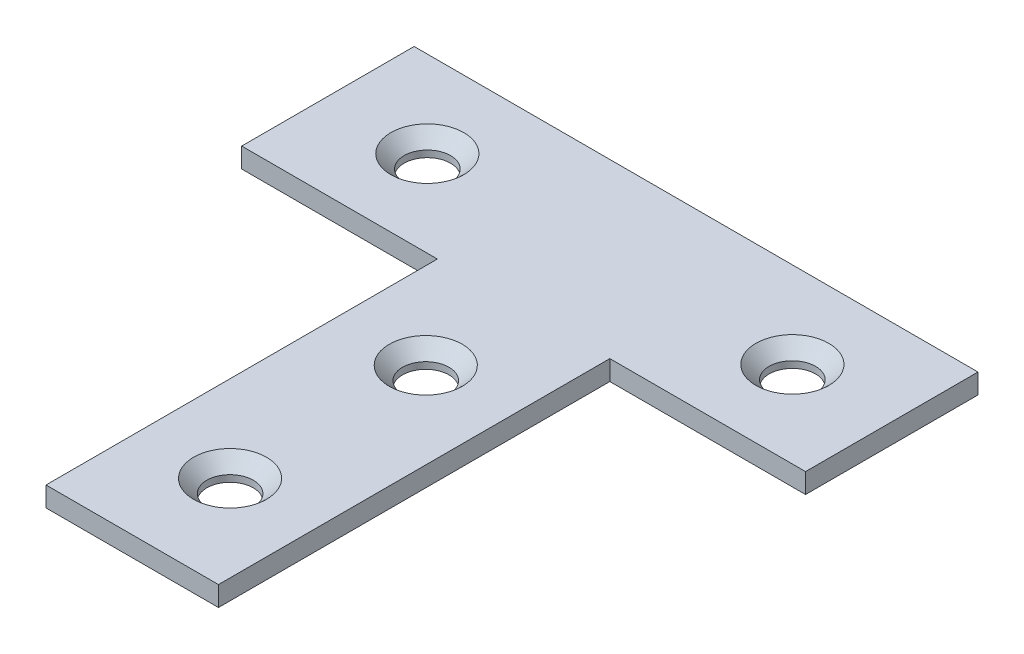
ISO-10303-21;
HEADER;
FILE_DESCRIPTION(('STEP AP214'),'2;1');
FILE_NAME('part.step','',(''),(''),'','','');
FILE_SCHEMA(('AUTOMOTIVE_DESIGN { 1 0 10303 214 1 1 1 1 }'));
ENDSEC;
DATA;
#1=APPLICATION_CONTEXT('core data for automotive mechanical design processes');
#2=APPLICATION_PROTOCOL_DEFINITION('international standard','automotive_design',2000,#1);
#3=PRODUCT_CONTEXT('',#1,'mechanical');
#4=PRODUCT('Part','Part','',(#3));
#5=PRODUCT_RELATED_PRODUCT_CATEGORY('part','',(#4));
#6=PRODUCT_DEFINITION_FORMATION('','',#4);
#7=PRODUCT_DEFINITION_CONTEXT('part definition',#1,'design');
#8=PRODUCT_DEFINITION('design','',#6,#7);
#9=PRODUCT_DEFINITION_SHAPE('','',#8);
#10=(LENGTH_UNIT() NAMED_UNIT(*) SI_UNIT(.MILLI.,.METRE.));
#11=(NAMED_UNIT(*) PLANE_ANGLE_UNIT() SI_UNIT($,.RADIAN.));
#12=(NAMED_UNIT(*) SI_UNIT($,.STERADIAN.) SOLID_ANGLE_UNIT());
#13=UNCERTAINTY_MEASURE_WITH_UNIT(LENGTH_MEASURE(1.E-05),#10,'distance_accuracy_value','');
#14=(GEOMETRIC_REPRESENTATION_CONTEXT(3) GLOBAL_UNCERTAINTY_ASSIGNED_CONTEXT((#13)) GLOBAL_UNIT_ASSIGNED_CONTEXT((#10,
#11,#12)) REPRESENTATION_CONTEXT('',''));
#15=CARTESIAN_POINT('',(0.,0.,0.));
#16=DIRECTION('',(0.,0.,1.));
#17=DIRECTION('',(1.,0.,0.));
#18=AXIS2_PLACEMENT_3D('',#15,#16,#17);
#19=CARTESIAN_POINT('',(21.25,1.5,-17.8484712230216));
#20=DIRECTION('',(1.,0.,0.));
#21=DIRECTION('',(0.,0.,-1.));
#22=AXIS2_PLACEMENT_3D('',#19,#20,#21);
#23=PLANE('',#22);
#24=DIRECTION('',(0.,0.,1.));
#25=VECTOR('',#24,1.);
#26=CARTESIAN_POINT('',(21.25,0.,-17.8484712230216));
#27=LINE('',#26,#25);
#28=CARTESIAN_POINT('',(21.25,0.,-17.8484712230216));
#29=VERTEX_POINT('',#28);
#30=CARTESIAN_POINT('',(21.25,0.,-4.84847122302159));
#31=VERTEX_POINT('',#30);
#32=EDGE_CURVE('E148',#29,#31,#27,.T.);
#33=ORIENTED_EDGE('',*,*,#32,.F.);
#34=DIRECTION('',(0.,-1.,0.));
#35=VECTOR('',#34,1.);
#36=CARTESIAN_POINT('',(21.25,1.5,-17.8484712230216));
#37=LINE('',#36,#35);
#38=CARTESIAN_POINT('',(21.25,1.5,-17.8484712230216));
#39=VERTEX_POINT('',#38);
#40=EDGE_CURVE('E59',#39,#29,#37,.T.);
#41=ORIENTED_EDGE('',*,*,#40,.F.);
#42=DIRECTION('',(0.,0.,1.));
#43=VECTOR('',#42,1.);
#44=CARTESIAN_POINT('',(21.25,1.5,-17.8484712230216));
#45=LINE('',#44,#43);
#46=CARTESIAN_POINT('',(21.25,1.5,-4.84847122302159));
#47=VERTEX_POINT('',#46);
#48=EDGE_CURVE('E175',#39,#47,#45,.T.);
#49=ORIENTED_EDGE('',*,*,#48,.T.);
#50=DIRECTION('',(0.,-1.,0.));
#51=VECTOR('',#50,1.);
#52=CARTESIAN_POINT('',(21.25,1.5,-4.84847122302159));
#53=LINE('',#52,#51);
#54=EDGE_CURVE('E97',#47,#31,#53,.T.);
#55=ORIENTED_EDGE('',*,*,#54,.T.);
#56=EDGE_LOOP('',(#33,#41,#49,#55));
#57=FACE_BOUND('',#56,.T.);
#58=ADVANCED_FACE('F40',(#57),#23,.T.);
#59=CARTESIAN_POINT('',(21.25,1.5,-17.8484712230216));
#60=DIRECTION('',(0.,0.,1.));
#61=DIRECTION('',(1.,0.,0.));
#62=AXIS2_PLACEMENT_3D('',#59,#60,#61);
#63=PLANE('',#62);
#64=DIRECTION('',(-1.,0.,0.));
#65=VECTOR('',#64,1.);
#66=CARTESIAN_POINT('',(21.25,0.,-17.8484712230216));
#67=LINE('',#66,#65);
#68=CARTESIAN_POINT('',(-21.25,0.,-17.8484712230216));
#69=VERTEX_POINT('',#68);
#70=EDGE_CURVE('E88',#29,#69,#67,.T.);
#71=ORIENTED_EDGE('',*,*,#70,.T.);
#72=DIRECTION('',(0.,-1.,0.));
#73=VECTOR('',#72,1.);
#74=CARTESIAN_POINT('',(-21.25,1.5,-17.8484712230216));
#75=LINE('',#74,#73);
#76=CARTESIAN_POINT('',(-21.25,1.5,-17.8484712230216));
#77=VERTEX_POINT('',#76);
#78=EDGE_CURVE('E132',#77,#69,#75,.T.);
#79=ORIENTED_EDGE('',*,*,#78,.F.);
#80=DIRECTION('',(-1.,0.,0.));
#81=VECTOR('',#80,1.);
#82=CARTESIAN_POINT('',(21.25,1.5,-17.8484712230216));
#83=LINE('',#82,#81);
#84=EDGE_CURVE('E120',#39,#77,#83,.T.);
#85=ORIENTED_EDGE('',*,*,#84,.F.);
#86=ORIENTED_EDGE('',*,*,#40,.T.);
#87=EDGE_LOOP('',(#71,#79,#85,#86));
#88=FACE_BOUND('',#87,.T.);
#89=ADVANCED_FACE('F258',(#88),#63,.F.);
#90=CARTESIAN_POINT('',(-21.25,1.5,-17.8484712230216));
#91=DIRECTION('',(1.,0.,0.));
#92=DIRECTION('',(0.,0.,-1.));
#93=AXIS2_PLACEMENT_3D('',#90,#91,#92);
#94=PLANE('',#93);
#95=DIRECTION('',(0.,0.,1.));
#96=VECTOR('',#95,1.);
#97=CARTESIAN_POINT('',(-21.25,0.,-17.8484712230216));
#98=LINE('',#97,#96);
#99=CARTESIAN_POINT('',(-21.25,0.,-4.84847122302159));
#100=VERTEX_POINT('',#99);
#101=EDGE_CURVE('E128',#69,#100,#98,.T.);
#102=ORIENTED_EDGE('',*,*,#101,.T.);
#103=DIRECTION('',(0.,-1.,0.));
#104=VECTOR('',#103,1.);
#105=CARTESIAN_POINT('',(-21.25,1.5,-4.84847122302159));
#106=LINE('',#105,#104);
#107=CARTESIAN_POINT('',(-21.25,1.5,-4.84847122302159));
#108=VERTEX_POINT('',#107);
#109=EDGE_CURVE('E125',#108,#100,#106,.T.);
#110=ORIENTED_EDGE('',*,*,#109,.F.);
#111=DIRECTION('',(0.,0.,1.));
#112=VECTOR('',#111,1.);
#113=CARTESIAN_POINT('',(-21.25,1.5,-17.8484712230216));
#114=LINE('',#113,#112);
#115=EDGE_CURVE('E113',#77,#108,#114,.T.);
#116=ORIENTED_EDGE('',*,*,#115,.F.);
#117=ORIENTED_EDGE('',*,*,#78,.T.);
#118=EDGE_LOOP('',(#102,#110,#116,#117));
#119=FACE_BOUND('',#118,.T.);
#120=ADVANCED_FACE('F126',(#119),#94,.F.);
#121=CARTESIAN_POINT('',(-21.25,1.5,-4.84847122302159));
#122=DIRECTION('',(0.,0.,-1.));
#123=DIRECTION('',(-1.,0.,0.));
#124=AXIS2_PLACEMENT_3D('',#121,#122,#123);
#125=PLANE('',#124);
#126=DIRECTION('',(1.,0.,0.));
#127=VECTOR('',#126,1.);
#128=CARTESIAN_POINT('',(-21.25,0.,-4.84847122302159));
#129=LINE('',#128,#127);
#130=CARTESIAN_POINT('',(-6.5,0.,-4.84847122302159));
#131=VERTEX_POINT('',#130);
#132=EDGE_CURVE('E168',#100,#131,#129,.T.);
#133=ORIENTED_EDGE('',*,*,#132,.T.);
#134=DIRECTION('',(0.,-1.,0.));
#135=VECTOR('',#134,1.);
#136=CARTESIAN_POINT('',(-6.5,1.5,-4.84847122302159));
#137=LINE('',#136,#135);
#138=CARTESIAN_POINT('',(-6.5,1.5,-4.84847122302159));
#139=VERTEX_POINT('',#138);
#140=EDGE_CURVE('E133',#139,#131,#137,.T.);
#141=ORIENTED_EDGE('',*,*,#140,.F.);
#142=DIRECTION('',(1.,0.,0.));
#143=VECTOR('',#142,1.);
#144=CARTESIAN_POINT('',(-21.25,1.5,-4.84847122302159));
#145=LINE('',#144,#143);
#146=EDGE_CURVE('E118',#108,#139,#145,.T.);
#147=ORIENTED_EDGE('',*,*,#146,.F.);
#148=ORIENTED_EDGE('',*,*,#109,.T.);
#149=EDGE_LOOP('',(#133,#141,#147,#148));
#150=FACE_BOUND('',#149,.T.);
#151=ADVANCED_FACE('F135',(#150),#125,.F.);
#152=CARTESIAN_POINT('',(-6.5,1.5,-4.84847122302159));
#153=DIRECTION('',(1.,0.,0.));
#154=DIRECTION('',(0.,0.,-1.));
#155=AXIS2_PLACEMENT_3D('',#152,#153,#154);
#156=PLANE('',#155);
#157=DIRECTION('',(0.,0.,1.));
#158=VECTOR('',#157,1.);
#159=CARTESIAN_POINT('',(-6.5,0.,-4.84847122302159));
#160=LINE('',#159,#158);
#161=CARTESIAN_POINT('',(-6.49999999999999,0.,24.6515287769784));
#162=VERTEX_POINT('',#161);
#163=EDGE_CURVE('E165',#131,#162,#160,.T.);
#164=ORIENTED_EDGE('',*,*,#163,.T.);
#165=DIRECTION('',(0.,-1.,0.));
#166=VECTOR('',#165,1.);
#167=CARTESIAN_POINT('',(-6.49999999999999,1.5,24.6515287769784));
#168=LINE('',#167,#166);
#169=CARTESIAN_POINT('',(-6.49999999999999,1.5,24.6515287769784));
#170=VERTEX_POINT('',#169);
#171=EDGE_CURVE('E183',#170,#162,#168,.T.);
#172=ORIENTED_EDGE('',*,*,#171,.F.);
#173=DIRECTION('',(0.,0.,1.));
#174=VECTOR('',#173,1.);
#175=CARTESIAN_POINT('',(-6.5,1.5,-4.84847122302159));
#176=LINE('',#175,#174);
#177=EDGE_CURVE('E139',#139,#170,#176,.T.);
#178=ORIENTED_EDGE('',*,*,#177,.F.);
#179=ORIENTED_EDGE('',*,*,#140,.T.);
#180=EDGE_LOOP('',(#164,#172,#178,#179));
#181=FACE_BOUND('',#180,.T.);
#182=ADVANCED_FACE('F273',(#181),#156,.F.);
#183=CARTESIAN_POINT('',(-6.49999999999999,1.5,24.6515287769784));
#184=DIRECTION('',(0.,0.,-1.));
#185=DIRECTION('',(-1.,0.,0.));
#186=AXIS2_PLACEMENT_3D('',#183,#184,#185);
#187=PLANE('',#186);
#188=DIRECTION('',(1.,0.,0.));
#189=VECTOR('',#188,1.);
#190=CARTESIAN_POINT('',(-6.49999999999999,0.,24.6515287769784));
#191=LINE('',#190,#189);
#192=CARTESIAN_POINT('',(6.50000000000001,0.,24.6515287769784));
#193=VERTEX_POINT('',#192);
#194=EDGE_CURVE('E161',#162,#193,#191,.T.);
#195=ORIENTED_EDGE('',*,*,#194,.T.);
#196=DIRECTION('',(0.,-1.,0.));
#197=VECTOR('',#196,1.);
#198=CARTESIAN_POINT('',(6.50000000000001,1.5,24.6515287769784));
#199=LINE('',#198,#197);
#200=CARTESIAN_POINT('',(6.50000000000001,1.5,24.6515287769784));
#201=VERTEX_POINT('',#200);
#202=EDGE_CURVE('E187',#201,#193,#199,.T.);
#203=ORIENTED_EDGE('',*,*,#202,.F.);
#204=DIRECTION('',(1.,0.,0.));
#205=VECTOR('',#204,1.);
#206=CARTESIAN_POINT('',(-6.49999999999999,1.5,24.6515287769784));
#207=LINE('',#206,#205);
#208=EDGE_CURVE('E142',#170,#201,#207,.T.);
#209=ORIENTED_EDGE('',*,*,#208,.F.);
#210=ORIENTED_EDGE('',*,*,#171,.T.);
#211=EDGE_LOOP('',(#195,#203,#209,#210));
#212=FACE_BOUND('',#211,.T.);
#213=ADVANCED_FACE('F269',(#212),#187,.F.);
#214=CARTESIAN_POINT('',(6.5,1.5,-4.84847122302159));
#215=DIRECTION('',(1.,0.,0.));
#216=DIRECTION('',(0.,0.,-1.));
#217=AXIS2_PLACEMENT_3D('',#214,#215,#216);
#218=PLANE('',#217);
#219=DIRECTION('',(0.,0.,1.));
#220=VECTOR('',#219,1.);
#221=CARTESIAN_POINT('',(6.5,0.,-4.84847122302159));
#222=LINE('',#221,#220);
#223=CARTESIAN_POINT('',(6.5,0.,-4.84847122302159));
#224=VERTEX_POINT('',#223);
#225=EDGE_CURVE('E157',#224,#193,#222,.T.);
#226=ORIENTED_EDGE('',*,*,#225,.F.);
#227=DIRECTION('',(0.,-1.,0.));
#228=VECTOR('',#227,1.);
#229=CARTESIAN_POINT('',(6.5,1.5,-4.84847122302159));
#230=LINE('',#229,#228);
#231=CARTESIAN_POINT('',(6.5,1.5,-4.84847122302159));
#232=VERTEX_POINT('',#231);
#233=EDGE_CURVE('E190',#232,#224,#230,.T.);
#234=ORIENTED_EDGE('',*,*,#233,.F.);
#235=DIRECTION('',(0.,0.,1.));
#236=VECTOR('',#235,1.);
#237=CARTESIAN_POINT('',(6.5,1.5,-4.84847122302159));
#238=LINE('',#237,#236);
#239=EDGE_CURVE('E320',#232,#201,#238,.T.);
#240=ORIENTED_EDGE('',*,*,#239,.T.);
#241=ORIENTED_EDGE('',*,*,#202,.T.);
#242=EDGE_LOOP('',(#226,#234,#240,#241));
#243=FACE_BOUND('',#242,.T.);
#244=ADVANCED_FACE('F266',(#243),#218,.T.);
#245=CARTESIAN_POINT('',(21.25,1.5,-4.84847122302159));
#246=DIRECTION('',(0.,0.,1.));
#247=DIRECTION('',(1.,0.,0.));
#248=AXIS2_PLACEMENT_3D('',#245,#246,#247);
#249=PLANE('',#248);
#250=DIRECTION('',(-1.,0.,0.));
#251=VECTOR('',#250,1.);
#252=CARTESIAN_POINT('',(21.25,0.,-4.84847122302159));
#253=LINE('',#252,#251);
#254=EDGE_CURVE('E152',#31,#224,#253,.T.);
#255=ORIENTED_EDGE('',*,*,#254,.F.);
#256=ORIENTED_EDGE('',*,*,#54,.F.);
#257=DIRECTION('',(-1.,0.,0.));
#258=VECTOR('',#257,1.);
#259=CARTESIAN_POINT('',(21.25,1.5,-4.84847122302159));
#260=LINE('',#259,#258);
#261=EDGE_CURVE('E317',#47,#232,#260,.T.);
#262=ORIENTED_EDGE('',*,*,#261,.T.);
#263=ORIENTED_EDGE('',*,*,#233,.T.);
#264=EDGE_LOOP('',(#255,#256,#262,#263));
#265=FACE_BOUND('',#264,.T.);
#266=ADVANCED_FACE('F233',(#265),#249,.T.);
#267=CARTESIAN_POINT('',(0.,1.5,0.));
#268=DIRECTION('',(0.,-1.,0.));
#269=DIRECTION('',(0.,0.,-1.));
#270=AXIS2_PLACEMENT_3D('',#267,#268,#269);
#271=PLANE('',#270);
#272=CARTESIAN_POINT('',(0.,1.5,17.2765287769784));
#273=DIRECTION('',(0.,-1.,0.));
#274=DIRECTION('',(0.,0.,-1.));
#275=AXIS2_PLACEMENT_3D('',#272,#273,#274);
#276=CIRCLE('',#275,2.75);
#277=CARTESIAN_POINT('',(0.,1.5,14.5265287769784));
#278=VERTEX_POINT('',#277);
#279=EDGE_CURVE('E210',#278,#278,#276,.T.);
#280=ORIENTED_EDGE('',*,*,#279,.T.);
#281=EDGE_LOOP('',(#280));
#282=FACE_BOUND('',#281,.T.);
#283=CARTESIAN_POINT('',(0.,1.5,2.52652877697841));
#284=DIRECTION('',(0.,-1.,0.));
#285=DIRECTION('',(0.,0.,-1.));
#286=AXIS2_PLACEMENT_3D('',#283,#284,#285);
#287=CIRCLE('',#286,2.75);
#288=CARTESIAN_POINT('',(0.,1.5,-0.223471223021595));
#289=VERTEX_POINT('',#288);
#290=EDGE_CURVE('E206',#289,#289,#287,.T.);
#291=ORIENTED_EDGE('',*,*,#290,.T.);
#292=EDGE_LOOP('',(#291));
#293=FACE_BOUND('',#292,.T.);
#294=CARTESIAN_POINT('',(13.7567998007634,1.5,-11.3484712230216));
#295=DIRECTION('',(0.,-1.,0.));
#296=DIRECTION('',(0.,0.,-1.));
#297=AXIS2_PLACEMENT_3D('',#294,#295,#296);
#298=CIRCLE('',#297,2.75);
#299=CARTESIAN_POINT('',(13.7567998007634,1.5,-14.0984712230216));
#300=VERTEX_POINT('',#299);
#301=EDGE_CURVE('E202',#300,#300,#298,.T.);
#302=ORIENTED_EDGE('',*,*,#301,.T.);
#303=EDGE_LOOP('',(#302));
#304=FACE_BOUND('',#303,.T.);
#305=CARTESIAN_POINT('',(-13.7567998007634,1.5,-11.3484712230216));
#306=DIRECTION('',(0.,-1.,0.));
#307=DIRECTION('',(0.,0.,-1.));
#308=AXIS2_PLACEMENT_3D('',#305,#306,#307);
#309=CIRCLE('',#308,2.75);
#310=CARTESIAN_POINT('',(-13.7567998007634,1.5,-14.0984712230216));
#311=VERTEX_POINT('',#310);
#312=EDGE_CURVE('E178',#311,#311,#309,.T.);
#313=ORIENTED_EDGE('',*,*,#312,.T.);
#314=EDGE_LOOP('',(#313));
#315=FACE_BOUND('',#314,.T.);
#316=ORIENTED_EDGE('',*,*,#48,.F.);
#317=ORIENTED_EDGE('',*,*,#84,.T.);
#318=ORIENTED_EDGE('',*,*,#115,.T.);
#319=ORIENTED_EDGE('',*,*,#146,.T.);
#320=ORIENTED_EDGE('',*,*,#177,.T.);
#321=ORIENTED_EDGE('',*,*,#208,.T.);
#322=ORIENTED_EDGE('',*,*,#239,.F.);
#323=ORIENTED_EDGE('',*,*,#261,.F.);
#324=EDGE_LOOP('',(#316,#317,#318,#319,#320,#321,#322,#323));
#325=FACE_BOUND('',#324,.T.);
#326=ADVANCED_FACE('F116',(#282,#293,#304,#315,#325),#271,.F.);
#327=CARTESIAN_POINT('',(0.,0.,0.));
#328=DIRECTION('',(0.,-1.,0.));
#329=DIRECTION('',(0.,0.,-1.));
#330=AXIS2_PLACEMENT_3D('',#327,#328,#329);
#331=PLANE('',#330);
#332=CARTESIAN_POINT('',(13.7567998007634,0.,-11.3484712230216));
#333=DIRECTION('',(0.,1.,0.));
#334=DIRECTION('',(0.,0.,-1.));
#335=AXIS2_PLACEMENT_3D('',#332,#333,#334);
#336=CIRCLE('',#335,1.75);
#337=CARTESIAN_POINT('',(13.7567998007634,0.,-13.0984712230216));
#338=VERTEX_POINT('',#337);
#339=EDGE_CURVE('E309',#338,#338,#336,.T.);
#340=ORIENTED_EDGE('',*,*,#339,.T.);
#341=EDGE_LOOP('',(#340));
#342=FACE_BOUND('',#341,.T.);
#343=CARTESIAN_POINT('',(-13.7567998007634,0.,-11.3484712230216));
#344=DIRECTION('',(0.,1.,0.));
#345=DIRECTION('',(0.,0.,1.));
#346=AXIS2_PLACEMENT_3D('',#343,#344,#345);
#347=CIRCLE('',#346,1.75);
#348=CARTESIAN_POINT('',(-13.7567998007634,0.,-9.59847122302159));
#349=VERTEX_POINT('',#348);
#350=EDGE_CURVE('E302',#349,#349,#347,.T.);
#351=ORIENTED_EDGE('',*,*,#350,.T.);
#352=EDGE_LOOP('',(#351));
#353=FACE_BOUND('',#352,.T.);
#354=CARTESIAN_POINT('',(0.,0.,17.2765287769784));
#355=DIRECTION('',(0.,1.,0.));
#356=DIRECTION('',(0.,0.,-1.));
#357=AXIS2_PLACEMENT_3D('',#354,#355,#356);
#358=CIRCLE('',#357,1.75);
#359=CARTESIAN_POINT('',(0.,0.,15.5265287769784));
#360=VERTEX_POINT('',#359);
#361=EDGE_CURVE('E299',#360,#360,#358,.T.);
#362=ORIENTED_EDGE('',*,*,#361,.T.);
#363=EDGE_LOOP('',(#362));
#364=FACE_BOUND('',#363,.T.);
#365=CARTESIAN_POINT('',(0.,0.,2.52652877697841));
#366=DIRECTION('',(0.,1.,0.));
#367=DIRECTION('',(0.,0.,1.));
#368=AXIS2_PLACEMENT_3D('',#365,#366,#367);
#369=CIRCLE('',#368,1.75);
#370=CARTESIAN_POINT('',(0.,0.,4.27652877697841));
#371=VERTEX_POINT('',#370);
#372=EDGE_CURVE('E153',#371,#371,#369,.T.);
#373=ORIENTED_EDGE('',*,*,#372,.T.);
#374=EDGE_LOOP('',(#373));
#375=FACE_BOUND('',#374,.T.);
#376=ORIENTED_EDGE('',*,*,#32,.T.);
#377=ORIENTED_EDGE('',*,*,#254,.T.);
#378=ORIENTED_EDGE('',*,*,#225,.T.);
#379=ORIENTED_EDGE('',*,*,#194,.F.);
#380=ORIENTED_EDGE('',*,*,#163,.F.);
#381=ORIENTED_EDGE('',*,*,#132,.F.);
#382=ORIENTED_EDGE('',*,*,#101,.F.);
#383=ORIENTED_EDGE('',*,*,#70,.F.);
#384=EDGE_LOOP('',(#376,#377,#378,#379,#380,#381,#382,#383));
#385=FACE_BOUND('',#384,.T.);
#386=ADVANCED_FACE('F232',(#342,#353,#364,#375,#385),#331,.T.);
#387=CARTESIAN_POINT('',(0.,0.,2.52652877697841));
#388=DIRECTION('',(0.,1.,0.));
#389=DIRECTION('',(0.,0.,1.));
#390=AXIS2_PLACEMENT_3D('',#387,#388,#389);
#391=CYLINDRICAL_SURFACE('',#390,1.75);
#392=CARTESIAN_POINT('',(0.,0.49999999999999,2.52652877697841));
#393=DIRECTION('',(0.,-1.,0.));
#394=DIRECTION('',(0.,0.,-1.));
#395=AXIS2_PLACEMENT_3D('',#392,#393,#394);
#396=CIRCLE('',#395,1.75);
#397=CARTESIAN_POINT('',(0.,0.49999999999999,0.776528776978408));
#398=VERTEX_POINT('',#397);
#399=EDGE_CURVE('E51',#398,#398,#396,.F.);
#400=ORIENTED_EDGE('',*,*,#399,.T.);
#401=EDGE_LOOP('',(#400));
#402=FACE_BOUND('',#401,.T.);
#403=ORIENTED_EDGE('',*,*,#372,.F.);
#404=EDGE_LOOP('',(#403));
#405=FACE_BOUND('',#404,.T.);
#406=ADVANCED_FACE('F221',(#402,#405),#391,.F.);
#407=CARTESIAN_POINT('',(0.,0.,17.2765287769784));
#408=DIRECTION('',(0.,1.,0.));
#409=DIRECTION('',(0.,0.,1.));
#410=AXIS2_PLACEMENT_3D('',#407,#408,#409);
#411=CYLINDRICAL_SURFACE('',#410,1.75);
#412=CARTESIAN_POINT('',(0.,0.500000000000001,17.2765287769784));
#413=DIRECTION('',(0.,-1.,0.));
#414=DIRECTION('',(0.,0.,-1.));
#415=AXIS2_PLACEMENT_3D('',#412,#413,#414);
#416=CIRCLE('',#415,1.75);
#417=CARTESIAN_POINT('',(0.,0.500000000000001,15.5265287769784));
#418=VERTEX_POINT('',#417);
#419=EDGE_CURVE('E214',#418,#418,#416,.F.);
#420=ORIENTED_EDGE('',*,*,#419,.T.);
#421=EDGE_LOOP('',(#420));
#422=FACE_BOUND('',#421,.T.);
#423=ORIENTED_EDGE('',*,*,#361,.F.);
#424=EDGE_LOOP('',(#423));
#425=FACE_BOUND('',#424,.T.);
#426=ADVANCED_FACE('F286',(#422,#425),#411,.F.);
#427=CARTESIAN_POINT('',(-13.7567998007634,0.,-11.3484712230216));
#428=DIRECTION('',(0.,1.,0.));
#429=DIRECTION('',(0.,0.,1.));
#430=AXIS2_PLACEMENT_3D('',#427,#428,#429);
#431=CYLINDRICAL_SURFACE('',#430,1.75);
#432=CARTESIAN_POINT('',(-13.7567998007634,0.49999999999999,-11.3484712230216));
#433=DIRECTION('',(0.,-1.,0.));
#434=DIRECTION('',(0.,0.,-1.));
#435=AXIS2_PLACEMENT_3D('',#432,#433,#434);
#436=CIRCLE('',#435,1.75);
#437=CARTESIAN_POINT('',(-13.7567998007634,0.49999999999999,-13.0984712230216));
#438=VERTEX_POINT('',#437);
#439=EDGE_CURVE('E198',#438,#438,#436,.F.);
#440=ORIENTED_EDGE('',*,*,#439,.T.);
#441=EDGE_LOOP('',(#440));
#442=FACE_BOUND('',#441,.T.);
#443=ORIENTED_EDGE('',*,*,#350,.F.);
#444=EDGE_LOOP('',(#443));
#445=FACE_BOUND('',#444,.T.);
#446=ADVANCED_FACE('F251',(#442,#445),#431,.F.);
#447=CARTESIAN_POINT('',(13.7567998007634,0.,-11.3484712230216));
#448=DIRECTION('',(0.,1.,0.));
#449=DIRECTION('',(0.,0.,1.));
#450=AXIS2_PLACEMENT_3D('',#447,#448,#449);
#451=CYLINDRICAL_SURFACE('',#450,1.75);
#452=CARTESIAN_POINT('',(13.7567998007634,0.500000000000004,-11.3484712230216));
#453=DIRECTION('',(0.,-1.,0.));
#454=DIRECTION('',(0.,0.,-1.));
#455=AXIS2_PLACEMENT_3D('',#452,#453,#454);
#456=CIRCLE('',#455,1.75);
#457=CARTESIAN_POINT('',(13.7567998007634,0.500000000000004,-13.0984712230216));
#458=VERTEX_POINT('',#457);
#459=EDGE_CURVE('E11',#458,#458,#456,.F.);
#460=ORIENTED_EDGE('',*,*,#459,.T.);
#461=EDGE_LOOP('',(#460));
#462=FACE_BOUND('',#461,.T.);
#463=ORIENTED_EDGE('',*,*,#339,.F.);
#464=EDGE_LOOP('',(#463));
#465=FACE_BOUND('',#464,.T.);
#466=ADVANCED_FACE('F242',(#462,#465),#451,.F.);
#467=CARTESIAN_POINT('',(-13.7567998007634,1.5,-11.3484712230216));
#468=DIRECTION('',(0.,1.,0.));
#469=DIRECTION('',(0.,0.,1.));
#470=AXIS2_PLACEMENT_3D('',#467,#468,#469);
#471=CONICAL_SURFACE('',#470,2.75,0.785398163397445);
#472=ORIENTED_EDGE('',*,*,#439,.F.);
#473=EDGE_LOOP('',(#472));
#474=FACE_BOUND('',#473,.T.);
#475=ORIENTED_EDGE('',*,*,#312,.F.);
#476=EDGE_LOOP('',(#475));
#477=FACE_BOUND('',#476,.T.);
#478=ADVANCED_FACE('F240',(#474,#477),#471,.F.);
#479=CARTESIAN_POINT('',(0.,1.5,17.2765287769784));
#480=DIRECTION('',(0.,1.,0.));
#481=DIRECTION('',(0.,0.,1.));
#482=AXIS2_PLACEMENT_3D('',#479,#480,#481);
#483=CONICAL_SURFACE('',#482,2.75,0.785398163397448);
#484=ORIENTED_EDGE('',*,*,#419,.F.);
#485=EDGE_LOOP('',(#484));
#486=FACE_BOUND('',#485,.T.);
#487=ORIENTED_EDGE('',*,*,#279,.F.);
#488=EDGE_LOOP('',(#487));
#489=FACE_BOUND('',#488,.T.);
#490=ADVANCED_FACE('F227',(#486,#489),#483,.F.);
#491=CARTESIAN_POINT('',(0.,1.5,2.52652877697841));
#492=DIRECTION('',(0.,1.,0.));
#493=DIRECTION('',(0.,0.,1.));
#494=AXIS2_PLACEMENT_3D('',#491,#492,#493);
#495=CONICAL_SURFACE('',#494,2.75,0.785398163397444);
#496=ORIENTED_EDGE('',*,*,#399,.F.);
#497=EDGE_LOOP('',(#496));
#498=FACE_BOUND('',#497,.T.);
#499=ORIENTED_EDGE('',*,*,#290,.F.);
#500=EDGE_LOOP('',(#499));
#501=FACE_BOUND('',#500,.T.);
#502=ADVANCED_FACE('F224',(#498,#501),#495,.F.);
#503=CARTESIAN_POINT('',(13.7567998007634,1.5,-11.3484712230216));
#504=DIRECTION('',(0.,1.,0.));
#505=DIRECTION('',(0.,0.,1.));
#506=AXIS2_PLACEMENT_3D('',#503,#504,#505);
#507=CONICAL_SURFACE('',#506,2.75,0.785398163397448);
#508=ORIENTED_EDGE('',*,*,#459,.F.);
#509=EDGE_LOOP('',(#508));
#510=FACE_BOUND('',#509,.T.);
#511=ORIENTED_EDGE('',*,*,#301,.F.);
#512=EDGE_LOOP('',(#511));
#513=FACE_BOUND('',#512,.T.);
#514=ADVANCED_FACE('F43',(#510,#513),#507,.F.);
#515=CLOSED_SHELL('',(#58,#89,#120,#151,#182,#213,#244,#266,#326,#386,#406,#426,#446,#466,#478,
#490,#502,#514));
#516=MANIFOLD_SOLID_BREP('B2',#515);
#517=ADVANCED_BREP_SHAPE_REPRESENTATION('',(#18,#516),#14);
#518=SHAPE_DEFINITION_REPRESENTATION(#9,#517);
ENDSEC;
END-ISO-10303-21;
